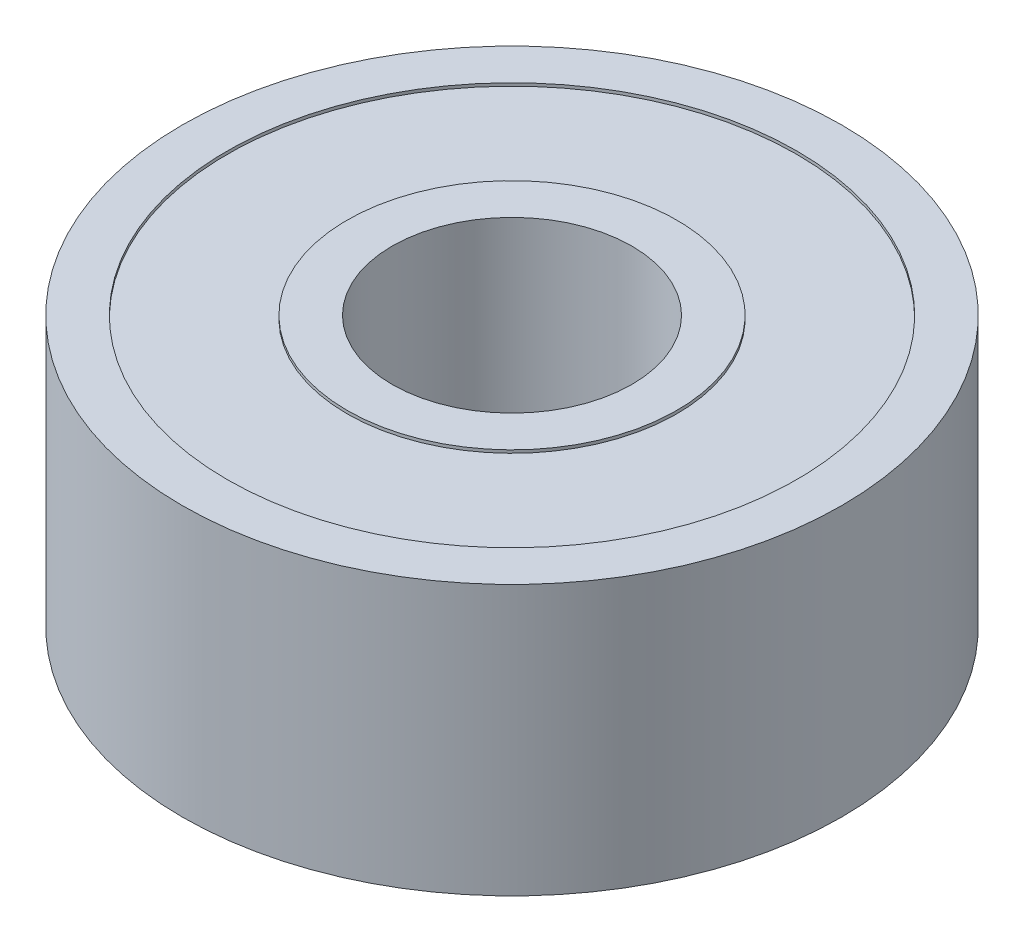
ISO-10303-21;
HEADER;
FILE_DESCRIPTION(('STEP AP214'),'2;1');
FILE_NAME('part.step','',(''),(''),'','','');
FILE_SCHEMA(('AUTOMOTIVE_DESIGN { 1 0 10303 214 1 1 1 1 }'));
ENDSEC;
DATA;
#1=APPLICATION_CONTEXT('core data for automotive mechanical design processes');
#2=APPLICATION_PROTOCOL_DEFINITION('international standard','automotive_design',2000,#1);
#3=PRODUCT_CONTEXT('',#1,'mechanical');
#4=PRODUCT('Part','Part','',(#3));
#5=PRODUCT_RELATED_PRODUCT_CATEGORY('part','',(#4));
#6=PRODUCT_DEFINITION_FORMATION('','',#4);
#7=PRODUCT_DEFINITION_CONTEXT('part definition',#1,'design');
#8=PRODUCT_DEFINITION('design','',#6,#7);
#9=PRODUCT_DEFINITION_SHAPE('','',#8);
#10=(LENGTH_UNIT() NAMED_UNIT(*) SI_UNIT(.MILLI.,.METRE.));
#11=(NAMED_UNIT(*) PLANE_ANGLE_UNIT() SI_UNIT($,.RADIAN.));
#12=(NAMED_UNIT(*) SI_UNIT($,.STERADIAN.) SOLID_ANGLE_UNIT());
#13=UNCERTAINTY_MEASURE_WITH_UNIT(LENGTH_MEASURE(1.E-05),#10,'distance_accuracy_value','');
#14=(GEOMETRIC_REPRESENTATION_CONTEXT(3) GLOBAL_UNCERTAINTY_ASSIGNED_CONTEXT((#13)) GLOBAL_UNIT_ASSIGNED_CONTEXT((#10,
#11,#12)) REPRESENTATION_CONTEXT('',''));
#15=CARTESIAN_POINT('',(0.,0.,0.));
#16=DIRECTION('',(0.,0.,1.));
#17=DIRECTION('',(1.,0.,0.));
#18=AXIS2_PLACEMENT_3D('',#15,#16,#17);
#19=CARTESIAN_POINT('',(0.,0.,0.));
#20=DIRECTION('',(0.,1.,0.));
#21=DIRECTION('',(0.,0.,1.));
#22=AXIS2_PLACEMENT_3D('',#19,#20,#21);
#23=PLANE('',#22);
#24=CARTESIAN_POINT('',(0.,0.,0.));
#25=DIRECTION('',(0.,1.,0.));
#26=DIRECTION('',(0.,0.,1.));
#27=AXIS2_PLACEMENT_3D('',#24,#25,#26);
#28=CIRCLE('',#27,4.);
#29=CARTESIAN_POINT('',(0.,0.,4.));
#30=VERTEX_POINT('',#29);
#31=EDGE_CURVE('E58',#30,#30,#28,.T.);
#32=ORIENTED_EDGE('',*,*,#31,.T.);
#33=EDGE_LOOP('',(#32));
#34=FACE_BOUND('',#33,.T.);
#35=CARTESIAN_POINT('',(0.,0.,0.));
#36=DIRECTION('',(0.,-1.,0.));
#37=DIRECTION('',(0.,0.,-1.));
#38=AXIS2_PLACEMENT_3D('',#35,#36,#37);
#39=CIRCLE('',#38,5.5);
#40=CARTESIAN_POINT('',(0.,0.,-5.5));
#41=VERTEX_POINT('',#40);
#42=EDGE_CURVE('E88',#41,#41,#39,.T.);
#43=ORIENTED_EDGE('',*,*,#42,.T.);
#44=EDGE_LOOP('',(#43));
#45=FACE_BOUND('',#44,.T.);
#46=ADVANCED_FACE('F50',(#34,#45),#23,.F.);
#47=CARTESIAN_POINT('',(0.,9.,0.));
#48=DIRECTION('',(0.,1.,0.));
#49=DIRECTION('',(0.,0.,1.));
#50=AXIS2_PLACEMENT_3D('',#47,#48,#49);
#51=PLANE('',#50);
#52=CARTESIAN_POINT('',(0.,9.,0.));
#53=DIRECTION('',(0.,1.,0.));
#54=DIRECTION('',(0.,0.,1.));
#55=AXIS2_PLACEMENT_3D('',#52,#53,#54);
#56=CIRCLE('',#55,4.);
#57=CARTESIAN_POINT('',(0.,9.,4.));
#58=VERTEX_POINT('',#57);
#59=EDGE_CURVE('E59',#58,#58,#56,.T.);
#60=ORIENTED_EDGE('',*,*,#59,.F.);
#61=EDGE_LOOP('',(#60));
#62=FACE_BOUND('',#61,.T.);
#63=CARTESIAN_POINT('',(0.,9.,0.));
#64=DIRECTION('',(0.,1.,0.));
#65=DIRECTION('',(0.,0.,1.));
#66=AXIS2_PLACEMENT_3D('',#63,#64,#65);
#67=CIRCLE('',#66,5.5);
#68=CARTESIAN_POINT('',(0.,9.,5.5));
#69=VERTEX_POINT('',#68);
#70=EDGE_CURVE('E75',#69,#69,#67,.T.);
#71=ORIENTED_EDGE('',*,*,#70,.T.);
#72=EDGE_LOOP('',(#71));
#73=FACE_BOUND('',#72,.T.);
#74=ADVANCED_FACE('F121',(#62,#73),#51,.T.);
#75=CARTESIAN_POINT('',(0.,9.,0.));
#76=DIRECTION('',(0.,1.,0.));
#77=DIRECTION('',(0.,0.,1.));
#78=AXIS2_PLACEMENT_3D('',#75,#76,#77);
#79=CIRCLE('',#78,9.5);
#80=CARTESIAN_POINT('',(0.,9.,9.5));
#81=VERTEX_POINT('',#80);
#82=EDGE_CURVE('E67',#81,#81,#79,.T.);
#83=ORIENTED_EDGE('',*,*,#82,.F.);
#84=EDGE_LOOP('',(#83));
#85=FACE_BOUND('',#84,.T.);
#86=CARTESIAN_POINT('',(0.,9.,0.));
#87=DIRECTION('',(0.,1.,0.));
#88=DIRECTION('',(0.,0.,1.));
#89=AXIS2_PLACEMENT_3D('',#86,#87,#88);
#90=CIRCLE('',#89,11.);
#91=CARTESIAN_POINT('',(0.,9.,11.));
#92=VERTEX_POINT('',#91);
#93=EDGE_CURVE('E10',#92,#92,#90,.T.);
#94=ORIENTED_EDGE('',*,*,#93,.T.);
#95=EDGE_LOOP('',(#94));
#96=FACE_BOUND('',#95,.T.);
#97=ADVANCED_FACE('F112',(#85,#96),#51,.T.);
#98=CARTESIAN_POINT('',(0.,0.,0.));
#99=DIRECTION('',(0.,-1.,0.));
#100=DIRECTION('',(0.,0.,-1.));
#101=AXIS2_PLACEMENT_3D('',#98,#99,#100);
#102=CIRCLE('',#101,9.5);
#103=CARTESIAN_POINT('',(0.,0.,-9.5));
#104=VERTEX_POINT('',#103);
#105=EDGE_CURVE('E78',#104,#104,#102,.T.);
#106=ORIENTED_EDGE('',*,*,#105,.F.);
#107=EDGE_LOOP('',(#106));
#108=FACE_BOUND('',#107,.T.);
#109=CARTESIAN_POINT('',(0.,0.,0.));
#110=DIRECTION('',(0.,1.,0.));
#111=DIRECTION('',(0.,0.,1.));
#112=AXIS2_PLACEMENT_3D('',#109,#110,#111);
#113=CIRCLE('',#112,11.);
#114=CARTESIAN_POINT('',(0.,0.,11.));
#115=VERTEX_POINT('',#114);
#116=EDGE_CURVE('E51',#115,#115,#113,.T.);
#117=ORIENTED_EDGE('',*,*,#116,.F.);
#118=EDGE_LOOP('',(#117));
#119=FACE_BOUND('',#118,.T.);
#120=ADVANCED_FACE('F107',(#108,#119),#23,.F.);
#121=CARTESIAN_POINT('',(0.,9.,0.));
#122=DIRECTION('',(0.,-1.,0.));
#123=DIRECTION('',(0.,0.,-1.));
#124=AXIS2_PLACEMENT_3D('',#121,#122,#123);
#125=CYLINDRICAL_SURFACE('',#124,11.);
#126=ORIENTED_EDGE('',*,*,#93,.F.);
#127=EDGE_LOOP('',(#126));
#128=FACE_BOUND('',#127,.T.);
#129=ORIENTED_EDGE('',*,*,#116,.T.);
#130=EDGE_LOOP('',(#129));
#131=FACE_BOUND('',#130,.T.);
#132=ADVANCED_FACE('F47',(#128,#131),#125,.T.);
#133=CARTESIAN_POINT('',(0.,9.,0.));
#134=DIRECTION('',(0.,-1.,0.));
#135=DIRECTION('',(0.,0.,-1.));
#136=AXIS2_PLACEMENT_3D('',#133,#134,#135);
#137=CYLINDRICAL_SURFACE('',#136,4.);
#138=ORIENTED_EDGE('',*,*,#59,.T.);
#139=EDGE_LOOP('',(#138));
#140=FACE_BOUND('',#139,.T.);
#141=ORIENTED_EDGE('',*,*,#31,.F.);
#142=EDGE_LOOP('',(#141));
#143=FACE_BOUND('',#142,.T.);
#144=ADVANCED_FACE('F113',(#140,#143),#137,.F.);
#145=CARTESIAN_POINT('',(0.,8.9,0.));
#146=DIRECTION('',(0.,1.,0.));
#147=DIRECTION('',(0.,0.,1.));
#148=AXIS2_PLACEMENT_3D('',#145,#146,#147);
#149=CYLINDRICAL_SURFACE('',#148,9.5);
#150=CARTESIAN_POINT('',(0.,8.9,0.));
#151=DIRECTION('',(0.,1.,0.));
#152=DIRECTION('',(0.,0.,1.));
#153=AXIS2_PLACEMENT_3D('',#150,#151,#152);
#154=CIRCLE('',#153,9.5);
#155=CARTESIAN_POINT('',(0.,8.9,9.5));
#156=VERTEX_POINT('',#155);
#157=EDGE_CURVE('E64',#156,#156,#154,.T.);
#158=ORIENTED_EDGE('',*,*,#157,.F.);
#159=EDGE_LOOP('',(#158));
#160=FACE_BOUND('',#159,.T.);
#161=ORIENTED_EDGE('',*,*,#82,.T.);
#162=EDGE_LOOP('',(#161));
#163=FACE_BOUND('',#162,.T.);
#164=ADVANCED_FACE('F118',(#160,#163),#149,.F.);
#165=CARTESIAN_POINT('',(0.,8.9,0.));
#166=DIRECTION('',(0.,1.,0.));
#167=DIRECTION('',(0.,0.,1.));
#168=AXIS2_PLACEMENT_3D('',#165,#166,#167);
#169=PLANE('',#168);
#170=CARTESIAN_POINT('',(0.,8.9,0.));
#171=DIRECTION('',(0.,1.,0.));
#172=DIRECTION('',(0.,0.,1.));
#173=AXIS2_PLACEMENT_3D('',#170,#171,#172);
#174=CIRCLE('',#173,5.5);
#175=CARTESIAN_POINT('',(0.,8.9,5.5));
#176=VERTEX_POINT('',#175);
#177=EDGE_CURVE('E66',#176,#176,#174,.T.);
#178=ORIENTED_EDGE('',*,*,#177,.F.);
#179=EDGE_LOOP('',(#178));
#180=FACE_BOUND('',#179,.T.);
#181=ORIENTED_EDGE('',*,*,#157,.T.);
#182=EDGE_LOOP('',(#181));
#183=FACE_BOUND('',#182,.T.);
#184=ADVANCED_FACE('F139',(#180,#183),#169,.T.);
#185=CARTESIAN_POINT('',(0.,8.9,0.));
#186=DIRECTION('',(0.,1.,0.));
#187=DIRECTION('',(0.,0.,1.));
#188=AXIS2_PLACEMENT_3D('',#185,#186,#187);
#189=CYLINDRICAL_SURFACE('',#188,5.5);
#190=ORIENTED_EDGE('',*,*,#177,.T.);
#191=EDGE_LOOP('',(#190));
#192=FACE_BOUND('',#191,.T.);
#193=ORIENTED_EDGE('',*,*,#70,.F.);
#194=EDGE_LOOP('',(#193));
#195=FACE_BOUND('',#194,.T.);
#196=ADVANCED_FACE('F102',(#192,#195),#189,.T.);
#197=CARTESIAN_POINT('',(0.,0.1,0.));
#198=DIRECTION('',(0.,-1.,0.));
#199=DIRECTION('',(0.,0.,-1.));
#200=AXIS2_PLACEMENT_3D('',#197,#198,#199);
#201=CYLINDRICAL_SURFACE('',#200,9.5);
#202=CARTESIAN_POINT('',(0.,0.1,0.));
#203=DIRECTION('',(0.,-1.,0.));
#204=DIRECTION('',(0.,0.,-1.));
#205=AXIS2_PLACEMENT_3D('',#202,#203,#204);
#206=CIRCLE('',#205,9.5);
#207=CARTESIAN_POINT('',(0.,0.1,-9.5));
#208=VERTEX_POINT('',#207);
#209=EDGE_CURVE('E77',#208,#208,#206,.T.);
#210=ORIENTED_EDGE('',*,*,#209,.F.);
#211=EDGE_LOOP('',(#210));
#212=FACE_BOUND('',#211,.T.);
#213=ORIENTED_EDGE('',*,*,#105,.T.);
#214=EDGE_LOOP('',(#213));
#215=FACE_BOUND('',#214,.T.);
#216=ADVANCED_FACE('F98',(#212,#215),#201,.F.);
#217=CARTESIAN_POINT('',(0.,0.1,0.));
#218=DIRECTION('',(0.,-1.,0.));
#219=DIRECTION('',(0.,0.,-1.));
#220=AXIS2_PLACEMENT_3D('',#217,#218,#219);
#221=PLANE('',#220);
#222=CARTESIAN_POINT('',(0.,0.1,0.));
#223=DIRECTION('',(0.,-1.,0.));
#224=DIRECTION('',(0.,0.,-1.));
#225=AXIS2_PLACEMENT_3D('',#222,#223,#224);
#226=CIRCLE('',#225,5.5);
#227=CARTESIAN_POINT('',(0.,0.1,-5.5));
#228=VERTEX_POINT('',#227);
#229=EDGE_CURVE('E84',#228,#228,#226,.T.);
#230=ORIENTED_EDGE('',*,*,#229,.F.);
#231=EDGE_LOOP('',(#230));
#232=FACE_BOUND('',#231,.T.);
#233=ORIENTED_EDGE('',*,*,#209,.T.);
#234=EDGE_LOOP('',(#233));
#235=FACE_BOUND('',#234,.T.);
#236=ADVANCED_FACE('F92',(#232,#235),#221,.T.);
#237=CARTESIAN_POINT('',(0.,0.1,0.));
#238=DIRECTION('',(0.,-1.,0.));
#239=DIRECTION('',(0.,0.,-1.));
#240=AXIS2_PLACEMENT_3D('',#237,#238,#239);
#241=CYLINDRICAL_SURFACE('',#240,5.5);
#242=ORIENTED_EDGE('',*,*,#229,.T.);
#243=EDGE_LOOP('',(#242));
#244=FACE_BOUND('',#243,.T.);
#245=ORIENTED_EDGE('',*,*,#42,.F.);
#246=EDGE_LOOP('',(#245));
#247=FACE_BOUND('',#246,.T.);
#248=ADVANCED_FACE('F95',(#244,#247),#241,.T.);
#249=CLOSED_SHELL('',(#46,#74,#97,#120,#132,#144,#164,#184,#196,#216,#236,#248));
#250=MANIFOLD_SOLID_BREP('B2',#249);
#251=ADVANCED_BREP_SHAPE_REPRESENTATION('',(#18,#250),#14);
#252=SHAPE_DEFINITION_REPRESENTATION(#9,#251);
ENDSEC;
END-ISO-10303-21;
